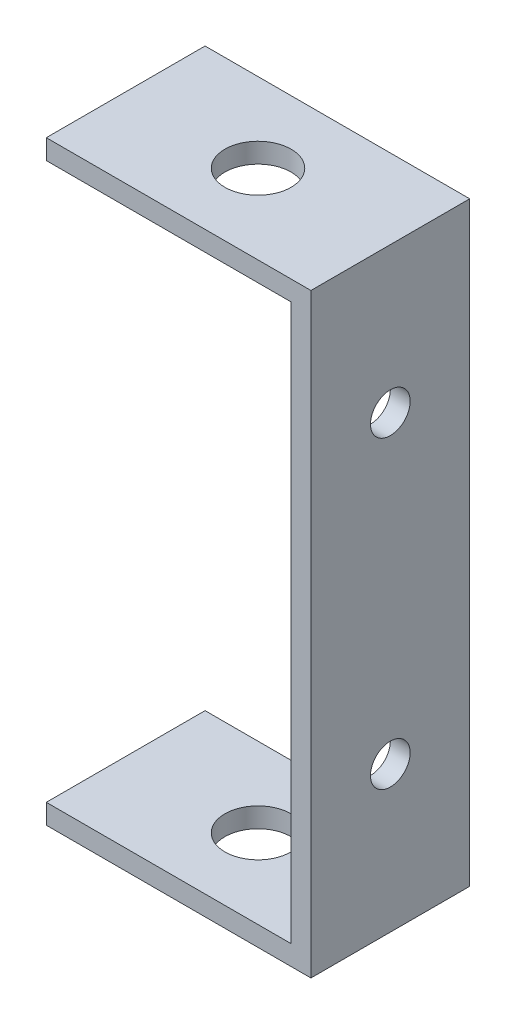
ISO-10303-21;
HEADER;
FILE_DESCRIPTION(('STEP AP214'),'2;1');
FILE_NAME('part.step','',(''),(''),'','','');
FILE_SCHEMA(('AUTOMOTIVE_DESIGN { 1 0 10303 214 1 1 1 1 }'));
ENDSEC;
DATA;
#1=APPLICATION_CONTEXT('core data for automotive mechanical design processes');
#2=APPLICATION_PROTOCOL_DEFINITION('international standard','automotive_design',2000,#1);
#3=PRODUCT_CONTEXT('',#1,'mechanical');
#4=PRODUCT('Part','Part','',(#3));
#5=PRODUCT_RELATED_PRODUCT_CATEGORY('part','',(#4));
#6=PRODUCT_DEFINITION_FORMATION('','',#4);
#7=PRODUCT_DEFINITION_CONTEXT('part definition',#1,'design');
#8=PRODUCT_DEFINITION('design','',#6,#7);
#9=PRODUCT_DEFINITION_SHAPE('','',#8);
#10=(LENGTH_UNIT() NAMED_UNIT(*) SI_UNIT(.MILLI.,.METRE.));
#11=(NAMED_UNIT(*) PLANE_ANGLE_UNIT() SI_UNIT($,.RADIAN.));
#12=(NAMED_UNIT(*) SI_UNIT($,.STERADIAN.) SOLID_ANGLE_UNIT());
#13=UNCERTAINTY_MEASURE_WITH_UNIT(LENGTH_MEASURE(1.E-05),#10,'distance_accuracy_value','');
#14=(GEOMETRIC_REPRESENTATION_CONTEXT(3) GLOBAL_UNCERTAINTY_ASSIGNED_CONTEXT((#13)) GLOBAL_UNIT_ASSIGNED_CONTEXT((#10,
#11,#12)) REPRESENTATION_CONTEXT('',''));
#15=CARTESIAN_POINT('',(0.,0.,0.));
#16=DIRECTION('',(0.,0.,1.));
#17=DIRECTION('',(1.,0.,0.));
#18=AXIS2_PLACEMENT_3D('',#15,#16,#17);
#19=CARTESIAN_POINT('',(8.50000000000001,-45.,0.));
#20=DIRECTION('',(-1.,0.,0.));
#21=DIRECTION('',(0.,0.,1.));
#22=AXIS2_PLACEMENT_3D('',#19,#20,#21);
#23=PLANE('',#22);
#24=CARTESIAN_POINT('',(8.50000000000001,-34.,0.));
#25=DIRECTION('',(-1.,0.,0.));
#26=DIRECTION('',(0.,0.,1.));
#27=AXIS2_PLACEMENT_3D('',#24,#25,#26);
#28=CIRCLE('',#27,1.5);
#29=CARTESIAN_POINT('',(8.50000000000001,-34.,1.5));
#30=VERTEX_POINT('',#29);
#31=EDGE_CURVE('E151',#30,#30,#28,.T.);
#32=ORIENTED_EDGE('',*,*,#31,.F.);
#33=EDGE_LOOP('',(#32));
#34=FACE_BOUND('',#33,.T.);
#35=CARTESIAN_POINT('',(8.50000000000001,-11.,0.));
#36=DIRECTION('',(-1.,0.,0.));
#37=DIRECTION('',(0.,0.,1.));
#38=AXIS2_PLACEMENT_3D('',#35,#36,#37);
#39=CIRCLE('',#38,1.5);
#40=CARTESIAN_POINT('',(8.50000000000001,-11.,1.5));
#41=VERTEX_POINT('',#40);
#42=EDGE_CURVE('E144',#41,#41,#39,.T.);
#43=ORIENTED_EDGE('',*,*,#42,.F.);
#44=EDGE_LOOP('',(#43));
#45=FACE_BOUND('',#44,.T.);
#46=DIRECTION('',(0.,1.,0.));
#47=VECTOR('',#46,1.);
#48=CARTESIAN_POINT('',(8.50000000000001,-45.,-6.));
#49=LINE('',#48,#47);
#50=CARTESIAN_POINT('',(8.50000000000001,-43.5,-6.));
#51=VERTEX_POINT('',#50);
#52=CARTESIAN_POINT('',(8.50000000000001,-1.50000000000002,-6.));
#53=VERTEX_POINT('',#52);
#54=EDGE_CURVE('E64',#51,#53,#49,.T.);
#55=ORIENTED_EDGE('',*,*,#54,.F.);
#56=DIRECTION('',(0.,0.,1.));
#57=VECTOR('',#56,1.);
#58=CARTESIAN_POINT('',(8.50000000000001,-43.5,0.));
#59=LINE('',#58,#57);
#60=CARTESIAN_POINT('',(8.50000000000001,-43.5,6.));
#61=VERTEX_POINT('',#60);
#62=EDGE_CURVE('E59',#51,#61,#59,.T.);
#63=ORIENTED_EDGE('',*,*,#62,.T.);
#64=DIRECTION('',(0.,1.,0.));
#65=VECTOR('',#64,1.);
#66=CARTESIAN_POINT('',(8.50000000000001,-45.,6.));
#67=LINE('',#66,#65);
#68=CARTESIAN_POINT('',(8.50000000000001,-1.5,6.));
#69=VERTEX_POINT('',#68);
#70=EDGE_CURVE('E170',#61,#69,#67,.T.);
#71=ORIENTED_EDGE('',*,*,#70,.T.);
#72=DIRECTION('',(0.,0.,1.));
#73=VECTOR('',#72,1.);
#74=CARTESIAN_POINT('',(8.50000000000001,-1.5,0.));
#75=LINE('',#74,#73);
#76=EDGE_CURVE('E195',#53,#69,#75,.T.);
#77=ORIENTED_EDGE('',*,*,#76,.F.);
#78=EDGE_LOOP('',(#55,#63,#71,#77));
#79=FACE_BOUND('',#78,.T.);
#80=ADVANCED_FACE('F41',(#34,#45,#79),#23,.T.);
#81=CARTESIAN_POINT('',(0.,-1.5,-6.));
#82=DIRECTION('',(0.,0.,1.));
#83=DIRECTION('',(1.,0.,0.));
#84=AXIS2_PLACEMENT_3D('',#81,#82,#83);
#85=PLANE('',#84);
#86=DIRECTION('',(1.,0.,0.));
#87=VECTOR('',#86,1.);
#88=CARTESIAN_POINT('',(0.,0.,-6.));
#89=LINE('',#88,#87);
#90=CARTESIAN_POINT('',(-9.99999999999999,0.,-6.));
#91=VERTEX_POINT('',#90);
#92=CARTESIAN_POINT('',(10.,0.,-6.));
#93=VERTEX_POINT('',#92);
#94=EDGE_CURVE('E173',#91,#93,#89,.T.);
#95=ORIENTED_EDGE('',*,*,#94,.T.);
#96=DIRECTION('',(0.,1.,0.));
#97=VECTOR('',#96,1.);
#98=CARTESIAN_POINT('',(10.,-45.,-6.));
#99=LINE('',#98,#97);
#100=CARTESIAN_POINT('',(10.,-45.,-6.));
#101=VERTEX_POINT('',#100);
#102=EDGE_CURVE('E176',#101,#93,#99,.T.);
#103=ORIENTED_EDGE('',*,*,#102,.F.);
#104=DIRECTION('',(1.,0.,0.));
#105=VECTOR('',#104,1.);
#106=CARTESIAN_POINT('',(0.,-45.,-6.));
#107=LINE('',#106,#105);
#108=CARTESIAN_POINT('',(-9.99999999999999,-45.,-6.));
#109=VERTEX_POINT('',#108);
#110=EDGE_CURVE('E110',#109,#101,#107,.T.);
#111=ORIENTED_EDGE('',*,*,#110,.F.);
#112=DIRECTION('',(0.,-1.,0.));
#113=VECTOR('',#112,1.);
#114=CARTESIAN_POINT('',(-9.99999999999999,-43.5,-6.));
#115=LINE('',#114,#113);
#116=CARTESIAN_POINT('',(-9.99999999999999,-43.5,-6.));
#117=VERTEX_POINT('',#116);
#118=EDGE_CURVE('E106',#117,#109,#115,.T.);
#119=ORIENTED_EDGE('',*,*,#118,.F.);
#120=DIRECTION('',(1.,0.,0.));
#121=VECTOR('',#120,1.);
#122=CARTESIAN_POINT('',(0.,-43.5,-6.));
#123=LINE('',#122,#121);
#124=EDGE_CURVE('E108',#117,#51,#123,.T.);
#125=ORIENTED_EDGE('',*,*,#124,.T.);
#126=ORIENTED_EDGE('',*,*,#54,.T.);
#127=DIRECTION('',(1.,0.,0.));
#128=VECTOR('',#127,1.);
#129=CARTESIAN_POINT('',(0.,-1.5,-6.));
#130=LINE('',#129,#128);
#131=CARTESIAN_POINT('',(-9.99999999999999,-1.5,-6.));
#132=VERTEX_POINT('',#131);
#133=EDGE_CURVE('E183',#132,#53,#130,.T.);
#134=ORIENTED_EDGE('',*,*,#133,.F.);
#135=DIRECTION('',(0.,1.,0.));
#136=VECTOR('',#135,1.);
#137=CARTESIAN_POINT('',(-9.99999999999999,-1.5,-6.));
#138=LINE('',#137,#136);
#139=EDGE_CURVE('E51',#132,#91,#138,.T.);
#140=ORIENTED_EDGE('',*,*,#139,.T.);
#141=EDGE_LOOP('',(#95,#103,#111,#119,#125,#126,#134,#140));
#142=FACE_BOUND('',#141,.T.);
#143=ADVANCED_FACE('F43',(#142),#85,.F.);
#144=CARTESIAN_POINT('',(0.,-1.5,6.));
#145=DIRECTION('',(0.,0.,1.));
#146=DIRECTION('',(1.,0.,0.));
#147=AXIS2_PLACEMENT_3D('',#144,#145,#146);
#148=PLANE('',#147);
#149=DIRECTION('',(1.,0.,0.));
#150=VECTOR('',#149,1.);
#151=CARTESIAN_POINT('',(0.,0.,6.));
#152=LINE('',#151,#150);
#153=CARTESIAN_POINT('',(-9.99999999999999,0.,6.));
#154=VERTEX_POINT('',#153);
#155=CARTESIAN_POINT('',(10.,0.,6.));
#156=VERTEX_POINT('',#155);
#157=EDGE_CURVE('E188',#154,#156,#152,.T.);
#158=ORIENTED_EDGE('',*,*,#157,.F.);
#159=DIRECTION('',(0.,1.,0.));
#160=VECTOR('',#159,1.);
#161=CARTESIAN_POINT('',(-9.99999999999999,-1.5,6.));
#162=LINE('',#161,#160);
#163=CARTESIAN_POINT('',(-9.99999999999999,-1.5,6.));
#164=VERTEX_POINT('',#163);
#165=EDGE_CURVE('E11',#164,#154,#162,.T.);
#166=ORIENTED_EDGE('',*,*,#165,.F.);
#167=DIRECTION('',(1.,0.,0.));
#168=VECTOR('',#167,1.);
#169=CARTESIAN_POINT('',(0.,-1.5,6.));
#170=LINE('',#169,#168);
#171=EDGE_CURVE('E191',#164,#69,#170,.T.);
#172=ORIENTED_EDGE('',*,*,#171,.T.);
#173=ORIENTED_EDGE('',*,*,#70,.F.);
#174=DIRECTION('',(1.,0.,0.));
#175=VECTOR('',#174,1.);
#176=CARTESIAN_POINT('',(0.,-43.5,6.));
#177=LINE('',#176,#175);
#178=CARTESIAN_POINT('',(-9.99999999999999,-43.5,6.));
#179=VERTEX_POINT('',#178);
#180=EDGE_CURVE('E137',#179,#61,#177,.T.);
#181=ORIENTED_EDGE('',*,*,#180,.F.);
#182=DIRECTION('',(0.,-1.,0.));
#183=VECTOR('',#182,1.);
#184=CARTESIAN_POINT('',(-9.99999999999999,-43.5,6.));
#185=LINE('',#184,#183);
#186=CARTESIAN_POINT('',(-9.99999999999999,-45.,6.));
#187=VERTEX_POINT('',#186);
#188=EDGE_CURVE('E117',#179,#187,#185,.T.);
#189=ORIENTED_EDGE('',*,*,#188,.T.);
#190=DIRECTION('',(1.,0.,0.));
#191=VECTOR('',#190,1.);
#192=CARTESIAN_POINT('',(0.,-45.,6.));
#193=LINE('',#192,#191);
#194=CARTESIAN_POINT('',(10.,-45.,6.));
#195=VERTEX_POINT('',#194);
#196=EDGE_CURVE('E156',#187,#195,#193,.T.);
#197=ORIENTED_EDGE('',*,*,#196,.T.);
#198=DIRECTION('',(0.,1.,0.));
#199=VECTOR('',#198,1.);
#200=CARTESIAN_POINT('',(10.,-45.,6.));
#201=LINE('',#200,#199);
#202=EDGE_CURVE('E166',#195,#156,#201,.T.);
#203=ORIENTED_EDGE('',*,*,#202,.T.);
#204=EDGE_LOOP('',(#158,#166,#172,#173,#181,#189,#197,#203));
#205=FACE_BOUND('',#204,.T.);
#206=ADVANCED_FACE('F223',(#205),#148,.T.);
#207=CARTESIAN_POINT('',(-9.99999999999999,-1.5,0.));
#208=DIRECTION('',(1.,0.,0.));
#209=DIRECTION('',(0.,0.,-1.));
#210=AXIS2_PLACEMENT_3D('',#207,#208,#209);
#211=PLANE('',#210);
#212=DIRECTION('',(0.,0.,-1.));
#213=VECTOR('',#212,1.);
#214=CARTESIAN_POINT('',(-9.99999999999999,0.,0.));
#215=LINE('',#214,#213);
#216=EDGE_CURVE('E201',#154,#91,#215,.T.);
#217=ORIENTED_EDGE('',*,*,#216,.T.);
#218=ORIENTED_EDGE('',*,*,#139,.F.);
#219=DIRECTION('',(0.,0.,-1.));
#220=VECTOR('',#219,1.);
#221=CARTESIAN_POINT('',(-9.99999999999999,-1.5,0.));
#222=LINE('',#221,#220);
#223=EDGE_CURVE('E187',#164,#132,#222,.T.);
#224=ORIENTED_EDGE('',*,*,#223,.F.);
#225=ORIENTED_EDGE('',*,*,#165,.T.);
#226=EDGE_LOOP('',(#217,#218,#224,#225));
#227=FACE_BOUND('',#226,.T.);
#228=ADVANCED_FACE('F273',(#227),#211,.F.);
#229=CARTESIAN_POINT('',(0.,-1.5,0.));
#230=DIRECTION('',(0.,1.,0.));
#231=DIRECTION('',(0.,0.,1.));
#232=AXIS2_PLACEMENT_3D('',#229,#230,#231);
#233=PLANE('',#232);
#234=CARTESIAN_POINT('',(0.,-1.5,0.));
#235=DIRECTION('',(0.,1.,0.));
#236=DIRECTION('',(0.,0.,1.));
#237=AXIS2_PLACEMENT_3D('',#234,#235,#236);
#238=CIRCLE('',#237,2.5);
#239=CARTESIAN_POINT('',(0.,-1.50000000000001,2.5));
#240=VERTEX_POINT('',#239);
#241=EDGE_CURVE('E138',#240,#240,#238,.T.);
#242=ORIENTED_EDGE('',*,*,#241,.T.);
#243=EDGE_LOOP('',(#242));
#244=FACE_BOUND('',#243,.T.);
#245=ORIENTED_EDGE('',*,*,#133,.T.);
#246=ORIENTED_EDGE('',*,*,#76,.T.);
#247=ORIENTED_EDGE('',*,*,#171,.F.);
#248=ORIENTED_EDGE('',*,*,#223,.T.);
#249=EDGE_LOOP('',(#245,#246,#247,#248));
#250=FACE_BOUND('',#249,.T.);
#251=ADVANCED_FACE('F270',(#244,#250),#233,.F.);
#252=CARTESIAN_POINT('',(0.,0.,0.));
#253=DIRECTION('',(0.,1.,0.));
#254=DIRECTION('',(0.,0.,1.));
#255=AXIS2_PLACEMENT_3D('',#252,#253,#254);
#256=PLANE('',#255);
#257=CARTESIAN_POINT('',(0.,0.,0.));
#258=DIRECTION('',(0.,1.,0.));
#259=DIRECTION('',(0.,0.,1.));
#260=AXIS2_PLACEMENT_3D('',#257,#258,#259);
#261=CIRCLE('',#260,2.5);
#262=CARTESIAN_POINT('',(0.,0.,2.5));
#263=VERTEX_POINT('',#262);
#264=EDGE_CURVE('E231',#263,#263,#261,.T.);
#265=ORIENTED_EDGE('',*,*,#264,.F.);
#266=EDGE_LOOP('',(#265));
#267=FACE_BOUND('',#266,.T.);
#268=ORIENTED_EDGE('',*,*,#94,.F.);
#269=ORIENTED_EDGE('',*,*,#216,.F.);
#270=ORIENTED_EDGE('',*,*,#157,.T.);
#271=DIRECTION('',(0.,0.,-1.));
#272=VECTOR('',#271,1.);
#273=CARTESIAN_POINT('',(10.,0.,0.));
#274=LINE('',#273,#272);
#275=EDGE_CURVE('E155',#156,#93,#274,.T.);
#276=ORIENTED_EDGE('',*,*,#275,.T.);
#277=EDGE_LOOP('',(#268,#269,#270,#276));
#278=FACE_BOUND('',#277,.T.);
#279=ADVANCED_FACE('F214',(#267,#278),#256,.T.);
#280=CARTESIAN_POINT('',(10.,-45.,0.));
#281=DIRECTION('',(1.,0.,0.));
#282=DIRECTION('',(0.,0.,-1.));
#283=AXIS2_PLACEMENT_3D('',#280,#281,#282);
#284=PLANE('',#283);
#285=CARTESIAN_POINT('',(10.,-34.,0.));
#286=DIRECTION('',(1.,0.,0.));
#287=DIRECTION('',(0.,0.,-1.));
#288=AXIS2_PLACEMENT_3D('',#285,#286,#287);
#289=CIRCLE('',#288,1.5);
#290=CARTESIAN_POINT('',(10.,-34.,-1.5));
#291=VERTEX_POINT('',#290);
#292=EDGE_CURVE('E140',#291,#291,#289,.T.);
#293=ORIENTED_EDGE('',*,*,#292,.F.);
#294=EDGE_LOOP('',(#293));
#295=FACE_BOUND('',#294,.T.);
#296=CARTESIAN_POINT('',(10.,-11.,0.));
#297=DIRECTION('',(1.,0.,0.));
#298=DIRECTION('',(0.,0.,-1.));
#299=AXIS2_PLACEMENT_3D('',#296,#297,#298);
#300=CIRCLE('',#299,1.5);
#301=CARTESIAN_POINT('',(10.,-11.,-1.5));
#302=VERTEX_POINT('',#301);
#303=EDGE_CURVE('E116',#302,#302,#300,.T.);
#304=ORIENTED_EDGE('',*,*,#303,.F.);
#305=EDGE_LOOP('',(#304));
#306=FACE_BOUND('',#305,.T.);
#307=ORIENTED_EDGE('',*,*,#275,.F.);
#308=ORIENTED_EDGE('',*,*,#202,.F.);
#309=DIRECTION('',(0.,0.,-1.));
#310=VECTOR('',#309,1.);
#311=CARTESIAN_POINT('',(10.,-45.,0.));
#312=LINE('',#311,#310);
#313=EDGE_CURVE('E160',#195,#101,#312,.T.);
#314=ORIENTED_EDGE('',*,*,#313,.T.);
#315=ORIENTED_EDGE('',*,*,#102,.T.);
#316=EDGE_LOOP('',(#307,#308,#314,#315));
#317=FACE_BOUND('',#316,.T.);
#318=ADVANCED_FACE('F218',(#295,#306,#317),#284,.T.);
#319=CARTESIAN_POINT('',(0.,-45.,0.));
#320=DIRECTION('',(0.,1.,0.));
#321=DIRECTION('',(0.,0.,1.));
#322=AXIS2_PLACEMENT_3D('',#319,#320,#321);
#323=PLANE('',#322);
#324=CARTESIAN_POINT('',(0.,-45.,0.));
#325=DIRECTION('',(0.,1.,0.));
#326=DIRECTION('',(0.,0.,1.));
#327=AXIS2_PLACEMENT_3D('',#324,#325,#326);
#328=CIRCLE('',#327,2.5);
#329=CARTESIAN_POINT('',(0.,-45.,2.5));
#330=VERTEX_POINT('',#329);
#331=EDGE_CURVE('E235',#330,#330,#328,.T.);
#332=ORIENTED_EDGE('',*,*,#331,.T.);
#333=EDGE_LOOP('',(#332));
#334=FACE_BOUND('',#333,.T.);
#335=ORIENTED_EDGE('',*,*,#196,.F.);
#336=DIRECTION('',(0.,0.,-1.));
#337=VECTOR('',#336,1.);
#338=CARTESIAN_POINT('',(-9.99999999999999,-45.,0.));
#339=LINE('',#338,#337);
#340=EDGE_CURVE('E135',#187,#109,#339,.T.);
#341=ORIENTED_EDGE('',*,*,#340,.T.);
#342=ORIENTED_EDGE('',*,*,#110,.T.);
#343=ORIENTED_EDGE('',*,*,#313,.F.);
#344=EDGE_LOOP('',(#335,#341,#342,#343));
#345=FACE_BOUND('',#344,.T.);
#346=ADVANCED_FACE('F221',(#334,#345),#323,.F.);
#347=CARTESIAN_POINT('',(-9.99999999999999,-11.,0.));
#348=DIRECTION('',(1.,0.,0.));
#349=DIRECTION('',(0.,0.,-1.));
#350=AXIS2_PLACEMENT_3D('',#347,#348,#349);
#351=CYLINDRICAL_SURFACE('',#350,1.5);
#352=ORIENTED_EDGE('',*,*,#42,.T.);
#353=EDGE_LOOP('',(#352));
#354=FACE_BOUND('',#353,.T.);
#355=ORIENTED_EDGE('',*,*,#303,.T.);
#356=EDGE_LOOP('',(#355));
#357=FACE_BOUND('',#356,.T.);
#358=ADVANCED_FACE('F306',(#354,#357),#351,.F.);
#359=CARTESIAN_POINT('',(-9.99999999999999,-34.,0.));
#360=DIRECTION('',(1.,0.,0.));
#361=DIRECTION('',(0.,0.,-1.));
#362=AXIS2_PLACEMENT_3D('',#359,#360,#361);
#363=CYLINDRICAL_SURFACE('',#362,1.5);
#364=ORIENTED_EDGE('',*,*,#31,.T.);
#365=EDGE_LOOP('',(#364));
#366=FACE_BOUND('',#365,.T.);
#367=ORIENTED_EDGE('',*,*,#292,.T.);
#368=EDGE_LOOP('',(#367));
#369=FACE_BOUND('',#368,.T.);
#370=ADVANCED_FACE('F312',(#366,#369),#363,.F.);
#371=CARTESIAN_POINT('',(-9.99999999999999,-43.5,0.));
#372=DIRECTION('',(-1.,0.,0.));
#373=DIRECTION('',(0.,0.,1.));
#374=AXIS2_PLACEMENT_3D('',#371,#372,#373);
#375=PLANE('',#374);
#376=ORIENTED_EDGE('',*,*,#340,.F.);
#377=ORIENTED_EDGE('',*,*,#188,.F.);
#378=DIRECTION('',(0.,0.,-1.));
#379=VECTOR('',#378,1.);
#380=CARTESIAN_POINT('',(-9.99999999999999,-43.5,0.));
#381=LINE('',#380,#379);
#382=EDGE_CURVE('E123',#179,#117,#381,.T.);
#383=ORIENTED_EDGE('',*,*,#382,.T.);
#384=ORIENTED_EDGE('',*,*,#118,.T.);
#385=EDGE_LOOP('',(#376,#377,#383,#384));
#386=FACE_BOUND('',#385,.T.);
#387=ADVANCED_FACE('F126',(#386),#375,.T.);
#388=CARTESIAN_POINT('',(0.,-43.5,0.));
#389=DIRECTION('',(0.,-1.,0.));
#390=DIRECTION('',(0.,0.,-1.));
#391=AXIS2_PLACEMENT_3D('',#388,#389,#390);
#392=PLANE('',#391);
#393=CARTESIAN_POINT('',(0.,-43.5,0.));
#394=DIRECTION('',(0.,-1.,0.));
#395=DIRECTION('',(0.,0.,-1.));
#396=AXIS2_PLACEMENT_3D('',#393,#394,#395);
#397=CIRCLE('',#396,2.5);
#398=CARTESIAN_POINT('',(0.,-43.5,2.5));
#399=VERTEX_POINT('',#398);
#400=EDGE_CURVE('E45',#399,#399,#397,.T.);
#401=ORIENTED_EDGE('',*,*,#400,.T.);
#402=EDGE_LOOP('',(#401));
#403=FACE_BOUND('',#402,.T.);
#404=ORIENTED_EDGE('',*,*,#180,.T.);
#405=ORIENTED_EDGE('',*,*,#62,.F.);
#406=ORIENTED_EDGE('',*,*,#124,.F.);
#407=ORIENTED_EDGE('',*,*,#382,.F.);
#408=EDGE_LOOP('',(#404,#405,#406,#407));
#409=FACE_BOUND('',#408,.T.);
#410=ADVANCED_FACE('F122',(#403,#409),#392,.F.);
#411=CARTESIAN_POINT('',(0.,-45.,0.));
#412=DIRECTION('',(0.,1.,0.));
#413=DIRECTION('',(0.,0.,1.));
#414=AXIS2_PLACEMENT_3D('',#411,#412,#413);
#415=CYLINDRICAL_SURFACE('',#414,2.5);
#416=CARTESIAN_POINT('',(0.,-45.,2.5));
#417=CARTESIAN_POINT('',(0.,-44.984375,2.5));
#418=CARTESIAN_POINT('',(0.,-44.96875,2.5));
#419=CARTESIAN_POINT('',(0.,-44.9375,2.5));
#420=CARTESIAN_POINT('',(0.,-44.921875,2.5));
#421=CARTESIAN_POINT('',(0.,-44.890625,2.5));
#422=CARTESIAN_POINT('',(0.,-44.875,2.5));
#423=CARTESIAN_POINT('',(0.,-44.84375,2.5));
#424=CARTESIAN_POINT('',(0.,-44.828125,2.5));
#425=CARTESIAN_POINT('',(0.,-44.796875,2.5));
#426=CARTESIAN_POINT('',(0.,-44.78125,2.5));
#427=CARTESIAN_POINT('',(0.,-44.75,2.5));
#428=CARTESIAN_POINT('',(0.,-44.734375,2.5));
#429=CARTESIAN_POINT('',(0.,-44.703125,2.5));
#430=CARTESIAN_POINT('',(0.,-44.6875,2.5));
#431=CARTESIAN_POINT('',(0.,-44.65625,2.5));
#432=CARTESIAN_POINT('',(0.,-44.640625,2.5));
#433=CARTESIAN_POINT('',(0.,-44.609375,2.5));
#434=CARTESIAN_POINT('',(0.,-44.59375,2.5));
#435=CARTESIAN_POINT('',(0.,-44.5625,2.5));
#436=CARTESIAN_POINT('',(0.,-44.546875,2.5));
#437=CARTESIAN_POINT('',(0.,-44.515625,2.5));
#438=CARTESIAN_POINT('',(0.,-44.5,2.5));
#439=CARTESIAN_POINT('',(0.,-44.46875,2.5));
#440=CARTESIAN_POINT('',(0.,-44.453125,2.5));
#441=CARTESIAN_POINT('',(0.,-44.421875,2.5));
#442=CARTESIAN_POINT('',(0.,-44.40625,2.5));
#443=CARTESIAN_POINT('',(0.,-44.375,2.5));
#444=CARTESIAN_POINT('',(0.,-44.359375,2.5));
#445=CARTESIAN_POINT('',(0.,-44.328125,2.5));
#446=CARTESIAN_POINT('',(0.,-44.3125,2.5));
#447=CARTESIAN_POINT('',(0.,-44.28125,2.5));
#448=CARTESIAN_POINT('',(0.,-44.265625,2.5));
#449=CARTESIAN_POINT('',(0.,-44.234375,2.5));
#450=CARTESIAN_POINT('',(0.,-44.21875,2.5));
#451=CARTESIAN_POINT('',(0.,-44.1875,2.5));
#452=CARTESIAN_POINT('',(0.,-44.171875,2.5));
#453=CARTESIAN_POINT('',(0.,-44.140625,2.5));
#454=CARTESIAN_POINT('',(0.,-44.125,2.5));
#455=CARTESIAN_POINT('',(0.,-44.09375,2.5));
#456=CARTESIAN_POINT('',(0.,-44.078125,2.5));
#457=CARTESIAN_POINT('',(0.,-44.046875,2.5));
#458=CARTESIAN_POINT('',(0.,-44.03125,2.5));
#459=CARTESIAN_POINT('',(0.,-44.,2.5));
#460=CARTESIAN_POINT('',(0.,-43.984375,2.5));
#461=CARTESIAN_POINT('',(0.,-43.953125,2.5));
#462=CARTESIAN_POINT('',(0.,-43.9375,2.5));
#463=CARTESIAN_POINT('',(0.,-43.90625,2.5));
#464=CARTESIAN_POINT('',(0.,-43.890625,2.5));
#465=CARTESIAN_POINT('',(0.,-43.859375,2.5));
#466=CARTESIAN_POINT('',(0.,-43.84375,2.5));
#467=CARTESIAN_POINT('',(0.,-43.8125,2.5));
#468=CARTESIAN_POINT('',(0.,-43.796875,2.5));
#469=CARTESIAN_POINT('',(0.,-43.765625,2.5));
#470=CARTESIAN_POINT('',(0.,-43.75,2.5));
#471=CARTESIAN_POINT('',(0.,-43.71875,2.5));
#472=CARTESIAN_POINT('',(0.,-43.703125,2.5));
#473=CARTESIAN_POINT('',(0.,-43.671875,2.5));
#474=CARTESIAN_POINT('',(0.,-43.65625,2.5));
#475=CARTESIAN_POINT('',(0.,-43.625,2.5));
#476=CARTESIAN_POINT('',(0.,-43.609375,2.5));
#477=CARTESIAN_POINT('',(0.,-43.578125,2.5));
#478=CARTESIAN_POINT('',(0.,-43.5625,2.5));
#479=CARTESIAN_POINT('',(0.,-43.53125,2.5));
#480=CARTESIAN_POINT('',(0.,-43.515625,2.5));
#481=CARTESIAN_POINT('',(0.,-43.5,2.5));
#482=B_SPLINE_CURVE_WITH_KNOTS('',3,(#416,#417,#418,#419,#420,#421,#422,#423,#424,#425,#426,
#427,#428,#429,#430,#431,#432,#433,#434,#435,#436,#437,#438,#439,#440,#441,#442,#443,#444,#445,
#446,#447,#448,#449,#450,#451,#452,#453,#454,#455,#456,#457,#458,#459,#460,#461,#462,#463,#464,
#465,#466,#467,#468,#469,#470,#471,#472,#473,#474,#475,#476,#477,#478,#479,#480,#481),
.UNSPECIFIED.,.F.,.F.,(4,2,2,2,2,2,2,2,2,2,2,2,2,2,2,2,2,2,2,2,2,2,2,2,2,2,2,2,2,2,2,2,4),(0.,
0.0468750000000018,0.0937500000000036,0.140625000000005,0.187500000000007,0.234375000000002,
0.281250000000004,0.328125000000005,0.375000000000007,0.421875000000009,0.468750000000004,
0.515625000000006,0.562500000000007,0.609375000000009,0.656250000000004,0.703125000000006,
0.750000000000008,0.796875000000009,0.843750000000011,0.890625000000006,0.937500000000008,
0.98437500000001,1.03125000000001,1.07812500000001,1.12500000000001,1.17187500000001,
1.21875000000001,1.26562500000001,1.31250000000001,1.35937500000001,1.40625000000001,
1.45312500000001,1.50000000000002),.UNSPECIFIED.);
#483=EDGE_CURVE('BSEAM245',#330,#399,#482,.T.);
#484=ORIENTED_EDGE('',*,*,#331,.F.);
#485=ORIENTED_EDGE('',*,*,#400,.F.);
#486=ORIENTED_EDGE('',*,*,#483,.T.);
#487=ORIENTED_EDGE('',*,*,#483,.F.);
#488=EDGE_LOOP('',(#484,#486,#485,#487));
#489=FACE_BOUND('',#488,.T.);
#490=ADVANCED_FACE('F245',(#489),#415,.F.);
#491=CARTESIAN_POINT('',(0.,0.,2.5));
#492=CARTESIAN_POINT('',(0.,-0.0156250000000075,2.5));
#493=CARTESIAN_POINT('',(0.,-0.0312500000000081,2.5));
#494=CARTESIAN_POINT('',(0.,-0.0625000000000093,2.5));
#495=CARTESIAN_POINT('',(0.,-0.0781250000000099,2.5));
#496=CARTESIAN_POINT('',(0.,-0.109375000000009,2.5));
#497=CARTESIAN_POINT('',(0.,-0.125000000000007,2.5));
#498=CARTESIAN_POINT('',(0.,-0.156250000000006,2.5));
#499=CARTESIAN_POINT('',(0.,-0.171875000000007,2.5));
#500=CARTESIAN_POINT('',(0.,-0.203125000000008,2.5));
#501=CARTESIAN_POINT('',(0.,-0.218750000000008,2.5));
#502=CARTESIAN_POINT('',(0.,-0.250000000000007,2.5));
#503=CARTESIAN_POINT('',(0.,-0.265625000000005,2.5));
#504=CARTESIAN_POINT('',(0.,-0.296875000000004,2.5));
#505=CARTESIAN_POINT('',(0.,-0.312500000000005,2.5));
#506=CARTESIAN_POINT('',(0.,-0.343750000000006,2.5));
#507=CARTESIAN_POINT('',(0.,-0.359375000000007,2.5));
#508=CARTESIAN_POINT('',(0.,-0.390625000000008,2.5));
#509=CARTESIAN_POINT('',(0.,-0.406250000000008,2.5));
#510=CARTESIAN_POINT('',(0.,-0.43750000000001,2.5));
#511=CARTESIAN_POINT('',(0.,-0.45312500000001,2.5));
#512=CARTESIAN_POINT('',(0.,-0.484375000000009,2.5));
#513=CARTESIAN_POINT('',(0.,-0.500000000000007,2.5));
#514=CARTESIAN_POINT('',(0.,-0.531250000000006,2.5));
#515=CARTESIAN_POINT('',(0.,-0.546875000000007,2.5));
#516=CARTESIAN_POINT('',(0.,-0.578125000000008,2.5));
#517=CARTESIAN_POINT('',(0.,-0.593750000000009,2.5));
#518=CARTESIAN_POINT('',(0.,-0.625000000000008,2.5));
#519=CARTESIAN_POINT('',(0.,-0.640625000000006,2.5));
#520=CARTESIAN_POINT('',(0.,-0.671875000000005,2.5));
#521=CARTESIAN_POINT('',(0.,-0.687500000000005,2.5));
#522=CARTESIAN_POINT('',(0.,-0.718750000000006,2.5));
#523=CARTESIAN_POINT('',(0.,-0.734375000000007,2.5));
#524=CARTESIAN_POINT('',(0.,-0.765625000000008,2.5));
#525=CARTESIAN_POINT('',(0.,-0.781250000000009,2.5));
#526=CARTESIAN_POINT('',(0.,-0.81250000000001,2.5));
#527=CARTESIAN_POINT('',(0.,-0.828125000000011,2.5));
#528=CARTESIAN_POINT('',(0.,-0.859375000000009,2.5));
#529=CARTESIAN_POINT('',(0.,-0.875000000000008,2.5));
#530=CARTESIAN_POINT('',(0.,-0.906250000000007,2.5));
#531=CARTESIAN_POINT('',(0.,-0.921875000000007,2.5));
#532=CARTESIAN_POINT('',(0.,-0.953125000000008,2.5));
#533=CARTESIAN_POINT('',(0.,-0.968750000000009,2.5));
#534=CARTESIAN_POINT('',(0.,-1.00000000000001,2.5));
#535=CARTESIAN_POINT('',(0.,-1.01562500000001,2.5));
#536=CARTESIAN_POINT('',(0.,-1.04687500000001,2.5));
#537=CARTESIAN_POINT('',(0.,-1.06250000000001,2.5));
#538=CARTESIAN_POINT('',(0.,-1.09375000000001,2.5));
#539=CARTESIAN_POINT('',(0.,-1.10937500000001,2.5));
#540=CARTESIAN_POINT('',(0.,-1.14062500000001,2.5));
#541=CARTESIAN_POINT('',(0.,-1.15625000000001,2.5));
#542=CARTESIAN_POINT('',(0.,-1.18750000000001,2.5));
#543=CARTESIAN_POINT('',(0.,-1.20312500000001,2.5));
#544=CARTESIAN_POINT('',(0.,-1.23437500000001,2.5));
#545=CARTESIAN_POINT('',(0.,-1.25000000000001,2.5));
#546=CARTESIAN_POINT('',(0.,-1.28125000000001,2.5));
#547=CARTESIAN_POINT('',(0.,-1.29687500000001,2.5));
#548=CARTESIAN_POINT('',(0.,-1.32812500000001,2.5));
#549=CARTESIAN_POINT('',(0.,-1.34375000000001,2.5));
#550=CARTESIAN_POINT('',(0.,-1.37500000000001,2.5));
#551=CARTESIAN_POINT('',(0.,-1.39062500000001,2.5));
#552=CARTESIAN_POINT('',(0.,-1.42187500000001,2.5));
#553=CARTESIAN_POINT('',(0.,-1.43750000000001,2.5));
#554=CARTESIAN_POINT('',(0.,-1.46875000000001,2.5));
#555=CARTESIAN_POINT('',(0.,-1.48437500000001,2.5));
#556=CARTESIAN_POINT('',(0.,-1.50000000000001,2.5));
#557=B_SPLINE_CURVE_WITH_KNOTS('',3,(#491,#492,#493,#494,#495,#496,#497,#498,#499,#500,#501,
#502,#503,#504,#505,#506,#507,#508,#509,#510,#511,#512,#513,#514,#515,#516,#517,#518,#519,#520,
#521,#522,#523,#524,#525,#526,#527,#528,#529,#530,#531,#532,#533,#534,#535,#536,#537,#538,#539,
#540,#541,#542,#543,#544,#545,#546,#547,#548,#549,#550,#551,#552,#553,#554,#555,#556),
.UNSPECIFIED.,.F.,.F.,(4,2,2,2,2,2,2,2,2,2,2,2,2,2,2,2,2,2,2,2,2,2,2,2,2,2,2,2,2,2,2,2,4),(0.,
0.0468750000000018,0.0937500000000036,0.140624999999998,0.1875,0.234375000000002,
0.281249999999997,0.328124999999999,0.375,0.421875000000002,0.468750000000004,0.515624999999999,
0.5625,0.609375000000002,0.656249999999997,0.703124999999999,0.750000000000001,
0.796875000000002,0.843750000000004,0.890624999999999,0.937500000000001,0.984375000000003,
1.03125,1.078125,1.125,1.171875,1.21875,1.265625,1.3125,1.359375,1.40625,1.453125,1.5),.UNSPECIFIED.);
#558=EDGE_CURVE('BSEAM247',#263,#240,#557,.T.);
#559=ORIENTED_EDGE('',*,*,#264,.T.);
#560=ORIENTED_EDGE('',*,*,#241,.F.);
#561=ORIENTED_EDGE('',*,*,#558,.T.);
#562=ORIENTED_EDGE('',*,*,#558,.F.);
#563=EDGE_LOOP('',(#559,#561,#560,#562));
#564=FACE_BOUND('',#563,.T.);
#565=ADVANCED_FACE('F247',(#564),#415,.F.);
#566=CLOSED_SHELL('',(#80,#143,#206,#228,#251,#279,#318,#346,#358,#370,#387,#410,#490,#565));
#567=MANIFOLD_SOLID_BREP('B2',#566);
#568=ADVANCED_BREP_SHAPE_REPRESENTATION('',(#18,#567),#14);
#569=SHAPE_DEFINITION_REPRESENTATION(#9,#568);
ENDSEC;
END-ISO-10303-21;
